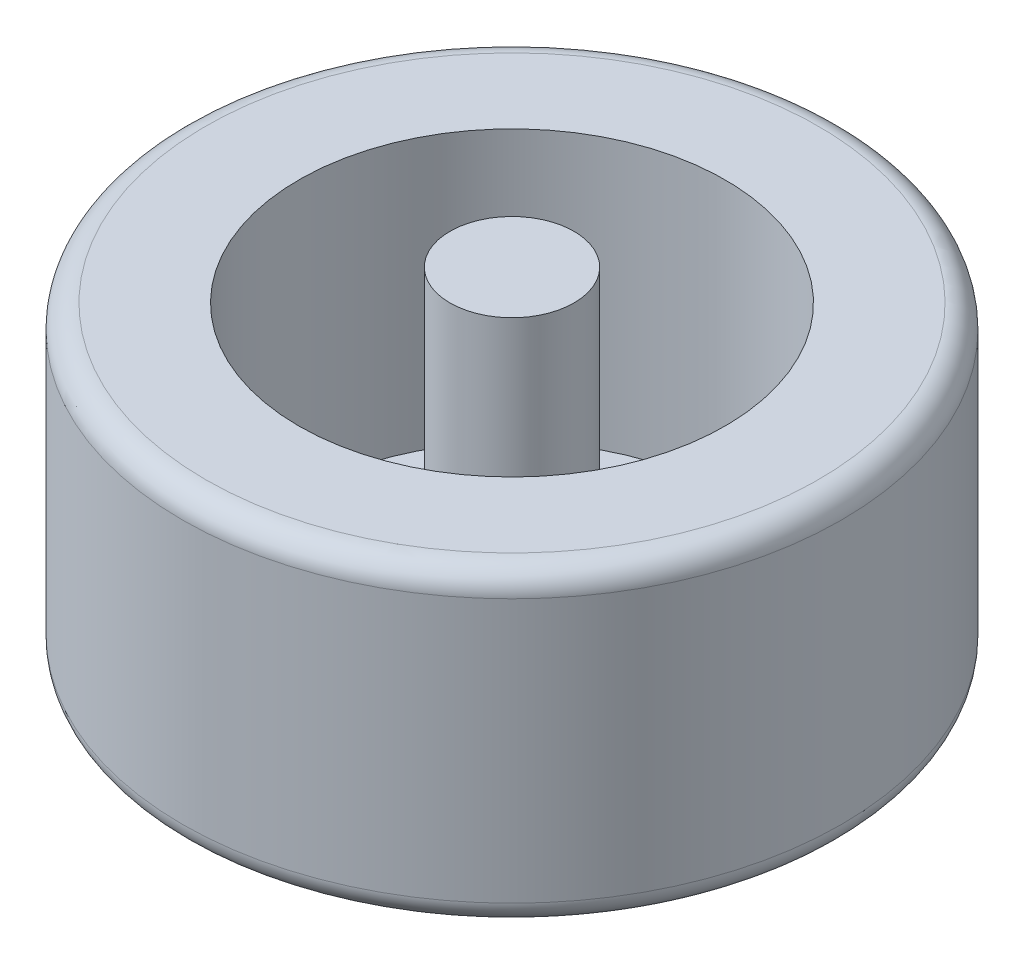
ISO-10303-21;
HEADER;
FILE_DESCRIPTION(('STEP AP214'),'2;1');
FILE_NAME('part.step','',(''),(''),'','','');
FILE_SCHEMA(('AUTOMOTIVE_DESIGN { 1 0 10303 214 1 1 1 1 }'));
ENDSEC;
DATA;
#1=APPLICATION_CONTEXT('core data for automotive mechanical design processes');
#2=APPLICATION_PROTOCOL_DEFINITION('international standard','automotive_design',2000,#1);
#3=PRODUCT_CONTEXT('',#1,'mechanical');
#4=PRODUCT('Part','Part','',(#3));
#5=PRODUCT_RELATED_PRODUCT_CATEGORY('part','',(#4));
#6=PRODUCT_DEFINITION_FORMATION('','',#4);
#7=PRODUCT_DEFINITION_CONTEXT('part definition',#1,'design');
#8=PRODUCT_DEFINITION('design','',#6,#7);
#9=PRODUCT_DEFINITION_SHAPE('','',#8);
#10=(LENGTH_UNIT() NAMED_UNIT(*) SI_UNIT(.MILLI.,.METRE.));
#11=(NAMED_UNIT(*) PLANE_ANGLE_UNIT() SI_UNIT($,.RADIAN.));
#12=(NAMED_UNIT(*) SI_UNIT($,.STERADIAN.) SOLID_ANGLE_UNIT());
#13=UNCERTAINTY_MEASURE_WITH_UNIT(LENGTH_MEASURE(1.E-05),#10,'distance_accuracy_value','');
#14=(GEOMETRIC_REPRESENTATION_CONTEXT(3) GLOBAL_UNCERTAINTY_ASSIGNED_CONTEXT((#13)) GLOBAL_UNIT_ASSIGNED_CONTEXT((#10,
#11,#12)) REPRESENTATION_CONTEXT('',''));
#15=CARTESIAN_POINT('',(0.,0.,0.));
#16=DIRECTION('',(0.,0.,1.));
#17=DIRECTION('',(1.,0.,0.));
#18=AXIS2_PLACEMENT_3D('',#15,#16,#17);
#19=CARTESIAN_POINT('',(0.,-30.,-17.75));
#20=DIRECTION('',(0.,1.,0.));
#21=DIRECTION('',(0.,0.,1.));
#22=AXIS2_PLACEMENT_3D('',#19,#20,#21);
#23=CYLINDRICAL_SURFACE('',#22,4.);
#24=CARTESIAN_POINT('',(0.,5.,-17.75));
#25=DIRECTION('',(0.,1.,0.));
#26=DIRECTION('',(0.,0.,1.));
#27=AXIS2_PLACEMENT_3D('',#24,#25,#26);
#28=CIRCLE('',#27,4.);
#29=CARTESIAN_POINT('',(0.,5.,-13.75));
#30=VERTEX_POINT('',#29);
#31=EDGE_CURVE('E71',#30,#30,#28,.T.);
#32=ORIENTED_EDGE('',*,*,#31,.T.);
#33=EDGE_LOOP('',(#32));
#34=FACE_BOUND('',#33,.T.);
#35=CARTESIAN_POINT('',(0.,2.,-17.75));
#36=DIRECTION('',(0.,-1.,0.));
#37=DIRECTION('',(0.,0.,-1.));
#38=AXIS2_PLACEMENT_3D('',#35,#36,#37);
#39=CIRCLE('',#38,4.);
#40=CARTESIAN_POINT('',(0.,2.,-21.75));
#41=VERTEX_POINT('',#40);
#42=EDGE_CURVE('E93',#41,#41,#39,.F.);
#43=ORIENTED_EDGE('',*,*,#42,.F.);
#44=EDGE_LOOP('',(#43));
#45=FACE_BOUND('',#44,.T.);
#46=ADVANCED_FACE('F37',(#34,#45),#23,.F.);
#47=CARTESIAN_POINT('',(12.5511453660612,-30.,-12.5511453660612));
#48=DIRECTION('',(0.,1.,0.));
#49=DIRECTION('',(0.,0.,1.));
#50=AXIS2_PLACEMENT_3D('',#47,#48,#49);
#51=CYLINDRICAL_SURFACE('',#50,4.);
#52=CARTESIAN_POINT('',(12.5511453660612,5.,-12.5511453660612));
#53=DIRECTION('',(0.,1.,0.));
#54=DIRECTION('',(-0.707106781186549,0.,0.707106781186546));
#55=AXIS2_PLACEMENT_3D('',#52,#53,#54);
#56=CIRCLE('',#55,4.);
#57=CARTESIAN_POINT('',(9.72271824131505,5.,-9.72271824131501));
#58=VERTEX_POINT('',#57);
#59=EDGE_CURVE('E74',#58,#58,#56,.T.);
#60=ORIENTED_EDGE('',*,*,#59,.T.);
#61=EDGE_LOOP('',(#60));
#62=FACE_BOUND('',#61,.T.);
#63=CARTESIAN_POINT('',(12.5511453660612,2.,-12.5511453660612));
#64=DIRECTION('',(0.,-1.,0.));
#65=DIRECTION('',(0.,0.,-1.));
#66=AXIS2_PLACEMENT_3D('',#63,#64,#65);
#67=CIRCLE('',#66,4.);
#68=CARTESIAN_POINT('',(12.5511453660612,2.,-16.5511453660612));
#69=VERTEX_POINT('',#68);
#70=EDGE_CURVE('E98',#69,#69,#67,.F.);
#71=ORIENTED_EDGE('',*,*,#70,.F.);
#72=EDGE_LOOP('',(#71));
#73=FACE_BOUND('',#72,.T.);
#74=ADVANCED_FACE('F144',(#62,#73),#51,.F.);
#75=CARTESIAN_POINT('',(-12.5511453660611,-30.,-12.5511453660614));
#76=DIRECTION('',(0.,1.,0.));
#77=DIRECTION('',(0.,0.,1.));
#78=AXIS2_PLACEMENT_3D('',#75,#76,#77);
#79=CYLINDRICAL_SURFACE('',#78,4.);
#80=CARTESIAN_POINT('',(-12.5511453660611,5.,-12.5511453660614));
#81=DIRECTION('',(0.,1.,0.));
#82=DIRECTION('',(0.707106781186539,0.,0.707106781186556));
#83=AXIS2_PLACEMENT_3D('',#80,#81,#82);
#84=CIRCLE('',#83,4.);
#85=CARTESIAN_POINT('',(-9.72271824131491,5.,-9.72271824131515));
#86=VERTEX_POINT('',#85);
#87=EDGE_CURVE('E90',#86,#86,#84,.T.);
#88=ORIENTED_EDGE('',*,*,#87,.T.);
#89=EDGE_LOOP('',(#88));
#90=FACE_BOUND('',#89,.T.);
#91=CARTESIAN_POINT('',(-12.5511453660611,2.,-12.5511453660614));
#92=DIRECTION('',(0.,-1.,0.));
#93=DIRECTION('',(0.,0.,-1.));
#94=AXIS2_PLACEMENT_3D('',#91,#92,#93);
#95=CIRCLE('',#94,4.);
#96=CARTESIAN_POINT('',(-12.5511453660611,2.,-16.5511453660614));
#97=VERTEX_POINT('',#96);
#98=EDGE_CURVE('E101',#97,#97,#95,.F.);
#99=ORIENTED_EDGE('',*,*,#98,.F.);
#100=EDGE_LOOP('',(#99));
#101=FACE_BOUND('',#100,.T.);
#102=ADVANCED_FACE('F149',(#90,#101),#79,.F.);
#103=CARTESIAN_POINT('',(-17.75,-30.,-1.85921381293397E-13));
#104=DIRECTION('',(0.,1.,0.));
#105=DIRECTION('',(0.,0.,1.));
#106=AXIS2_PLACEMENT_3D('',#103,#104,#105);
#107=CYLINDRICAL_SURFACE('',#106,4.);
#108=CARTESIAN_POINT('',(-17.75,5.,-1.85921381293397E-13));
#109=DIRECTION('',(0.,1.,0.));
#110=DIRECTION('',(1.,0.,0.));
#111=AXIS2_PLACEMENT_3D('',#108,#109,#110);
#112=CIRCLE('',#111,4.);
#113=CARTESIAN_POINT('',(-13.75,5.,-1.44023605227279E-13));
#114=VERTEX_POINT('',#113);
#115=EDGE_CURVE('E82',#114,#114,#112,.T.);
#116=ORIENTED_EDGE('',*,*,#115,.T.);
#117=EDGE_LOOP('',(#116));
#118=FACE_BOUND('',#117,.T.);
#119=CARTESIAN_POINT('',(-17.75,2.,-1.85921381293397E-13));
#120=DIRECTION('',(0.,-1.,0.));
#121=DIRECTION('',(0.,0.,-1.));
#122=AXIS2_PLACEMENT_3D('',#119,#120,#121);
#123=CIRCLE('',#122,4.);
#124=CARTESIAN_POINT('',(-17.75,2.,-4.00000000000019));
#125=VERTEX_POINT('',#124);
#126=EDGE_CURVE('E104',#125,#125,#123,.F.);
#127=ORIENTED_EDGE('',*,*,#126,.F.);
#128=EDGE_LOOP('',(#127));
#129=FACE_BOUND('',#128,.T.);
#130=ADVANCED_FACE('F158',(#118,#129),#107,.F.);
#131=CARTESIAN_POINT('',(-12.5511453660613,-30.,12.5511453660611));
#132=DIRECTION('',(0.,1.,0.));
#133=DIRECTION('',(0.,0.,1.));
#134=AXIS2_PLACEMENT_3D('',#131,#132,#133);
#135=CYLINDRICAL_SURFACE('',#134,4.);
#136=CARTESIAN_POINT('',(-12.5511453660613,5.,12.5511453660611));
#137=DIRECTION('',(0.,1.,0.));
#138=DIRECTION('',(0.707106781186554,0.,-0.707106781186541));
#139=AXIS2_PLACEMENT_3D('',#136,#137,#138);
#140=CIRCLE('',#139,4.);
#141=CARTESIAN_POINT('',(-9.72271824131511,5.,9.72271824131495));
#142=VERTEX_POINT('',#141);
#143=EDGE_CURVE('E78',#142,#142,#140,.T.);
#144=ORIENTED_EDGE('',*,*,#143,.T.);
#145=EDGE_LOOP('',(#144));
#146=FACE_BOUND('',#145,.T.);
#147=CARTESIAN_POINT('',(-12.5511453660613,2.,12.5511453660611));
#148=DIRECTION('',(0.,-1.,0.));
#149=DIRECTION('',(0.,0.,-1.));
#150=AXIS2_PLACEMENT_3D('',#147,#148,#149);
#151=CIRCLE('',#150,4.);
#152=CARTESIAN_POINT('',(-12.5511453660613,2.,8.55114536606111));
#153=VERTEX_POINT('',#152);
#154=EDGE_CURVE('E107',#153,#153,#151,.F.);
#155=ORIENTED_EDGE('',*,*,#154,.F.);
#156=EDGE_LOOP('',(#155));
#157=FACE_BOUND('',#156,.T.);
#158=ADVANCED_FACE('F154',(#146,#157),#135,.F.);
#159=CARTESIAN_POINT('',(0.,-30.,17.75));
#160=DIRECTION('',(0.,1.,0.));
#161=DIRECTION('',(0.,0.,1.));
#162=AXIS2_PLACEMENT_3D('',#159,#160,#161);
#163=CYLINDRICAL_SURFACE('',#162,4.);
#164=CARTESIAN_POINT('',(0.,5.,17.75));
#165=DIRECTION('',(0.,1.,0.));
#166=DIRECTION('',(0.,0.,-1.));
#167=AXIS2_PLACEMENT_3D('',#164,#165,#166);
#168=CIRCLE('',#167,4.);
#169=CARTESIAN_POINT('',(0.,5.,13.75));
#170=VERTEX_POINT('',#169);
#171=EDGE_CURVE('E81',#170,#170,#168,.T.);
#172=ORIENTED_EDGE('',*,*,#171,.T.);
#173=EDGE_LOOP('',(#172));
#174=FACE_BOUND('',#173,.T.);
#175=CARTESIAN_POINT('',(0.,2.,17.75));
#176=DIRECTION('',(0.,-1.,0.));
#177=DIRECTION('',(0.,0.,-1.));
#178=AXIS2_PLACEMENT_3D('',#175,#176,#177);
#179=CIRCLE('',#178,4.);
#180=CARTESIAN_POINT('',(0.,2.,13.75));
#181=VERTEX_POINT('',#180);
#182=EDGE_CURVE('E110',#181,#181,#179,.F.);
#183=ORIENTED_EDGE('',*,*,#182,.F.);
#184=EDGE_LOOP('',(#183));
#185=FACE_BOUND('',#184,.T.);
#186=ADVANCED_FACE('F157',(#174,#185),#163,.F.);
#187=CARTESIAN_POINT('',(12.5511453660612,-30.,12.5511453660613));
#188=DIRECTION('',(0.,1.,0.));
#189=DIRECTION('',(0.,0.,1.));
#190=AXIS2_PLACEMENT_3D('',#187,#188,#189);
#191=CYLINDRICAL_SURFACE('',#190,4.);
#192=CARTESIAN_POINT('',(12.5511453660612,5.,12.5511453660613));
#193=DIRECTION('',(0.,1.,0.));
#194=DIRECTION('',(-0.707106781186544,0.,-0.707106781186551));
#195=AXIS2_PLACEMENT_3D('',#192,#193,#194);
#196=CIRCLE('',#195,4.);
#197=CARTESIAN_POINT('',(9.72271824131498,5.,9.72271824131508));
#198=VERTEX_POINT('',#197);
#199=EDGE_CURVE('E85',#198,#198,#196,.T.);
#200=ORIENTED_EDGE('',*,*,#199,.T.);
#201=EDGE_LOOP('',(#200));
#202=FACE_BOUND('',#201,.T.);
#203=CARTESIAN_POINT('',(12.5511453660612,2.,12.5511453660613));
#204=DIRECTION('',(0.,-1.,0.));
#205=DIRECTION('',(0.,0.,-1.));
#206=AXIS2_PLACEMENT_3D('',#203,#204,#205);
#207=CIRCLE('',#206,4.);
#208=CARTESIAN_POINT('',(12.5511453660612,2.,8.55114536606128));
#209=VERTEX_POINT('',#208);
#210=EDGE_CURVE('E61',#209,#209,#207,.F.);
#211=ORIENTED_EDGE('',*,*,#210,.F.);
#212=EDGE_LOOP('',(#211));
#213=FACE_BOUND('',#212,.T.);
#214=ADVANCED_FACE('F162',(#202,#213),#191,.F.);
#215=CARTESIAN_POINT('',(17.75,-30.,0.));
#216=DIRECTION('',(0.,1.,0.));
#217=DIRECTION('',(0.,0.,1.));
#218=AXIS2_PLACEMENT_3D('',#215,#216,#217);
#219=CYLINDRICAL_SURFACE('',#218,4.);
#220=CARTESIAN_POINT('',(17.75,5.,0.));
#221=DIRECTION('',(0.,1.,0.));
#222=DIRECTION('',(-1.,0.,0.));
#223=AXIS2_PLACEMENT_3D('',#220,#221,#222);
#224=CIRCLE('',#223,4.);
#225=CARTESIAN_POINT('',(13.75,5.,0.));
#226=VERTEX_POINT('',#225);
#227=EDGE_CURVE('E77',#226,#226,#224,.T.);
#228=ORIENTED_EDGE('',*,*,#227,.T.);
#229=EDGE_LOOP('',(#228));
#230=FACE_BOUND('',#229,.T.);
#231=CARTESIAN_POINT('',(17.75,2.,0.));
#232=DIRECTION('',(0.,-1.,0.));
#233=DIRECTION('',(0.,0.,-1.));
#234=AXIS2_PLACEMENT_3D('',#231,#232,#233);
#235=CIRCLE('',#234,4.);
#236=CARTESIAN_POINT('',(17.75,2.,-3.99999999999994));
#237=VERTEX_POINT('',#236);
#238=EDGE_CURVE('E58',#237,#237,#235,.F.);
#239=ORIENTED_EDGE('',*,*,#238,.F.);
#240=EDGE_LOOP('',(#239));
#241=FACE_BOUND('',#240,.T.);
#242=ADVANCED_FACE('F166',(#230,#241),#219,.F.);
#243=CARTESIAN_POINT('',(0.,40.,0.));
#244=DIRECTION('',(0.,-1.,0.));
#245=DIRECTION('',(0.,0.,-1.));
#246=AXIS2_PLACEMENT_3D('',#243,#244,#245);
#247=CYLINDRICAL_SURFACE('',#246,42.5);
#248=CARTESIAN_POINT('',(0.,3.,0.));
#249=DIRECTION('',(0.,1.,0.));
#250=DIRECTION('',(0.,0.,1.));
#251=AXIS2_PLACEMENT_3D('',#248,#249,#250);
#252=CIRCLE('',#251,42.5);
#253=CARTESIAN_POINT('',(0.,3.,42.5));
#254=VERTEX_POINT('',#253);
#255=EDGE_CURVE('E48',#254,#254,#252,.T.);
#256=ORIENTED_EDGE('',*,*,#255,.T.);
#257=EDGE_LOOP('',(#256));
#258=FACE_BOUND('',#257,.T.);
#259=CARTESIAN_POINT('',(0.,37.,0.));
#260=DIRECTION('',(0.,1.,0.));
#261=DIRECTION('',(0.,0.,1.));
#262=AXIS2_PLACEMENT_3D('',#259,#260,#261);
#263=CIRCLE('',#262,42.5);
#264=CARTESIAN_POINT('',(0.,37.,42.5));
#265=VERTEX_POINT('',#264);
#266=EDGE_CURVE('E52',#265,#265,#263,.F.);
#267=ORIENTED_EDGE('',*,*,#266,.T.);
#268=EDGE_LOOP('',(#267));
#269=FACE_BOUND('',#268,.T.);
#270=ADVANCED_FACE('F170',(#258,#269),#247,.T.);
#271=CARTESIAN_POINT('',(0.,40.,0.));
#272=DIRECTION('',(0.,1.,0.));
#273=DIRECTION('',(0.,0.,1.));
#274=AXIS2_PLACEMENT_3D('',#271,#272,#273);
#275=PLANE('',#274);
#276=CARTESIAN_POINT('',(0.,40.,0.));
#277=DIRECTION('',(0.,1.,0.));
#278=DIRECTION('',(0.,0.,1.));
#279=AXIS2_PLACEMENT_3D('',#276,#277,#278);
#280=CIRCLE('',#279,39.5);
#281=CARTESIAN_POINT('',(0.,40.,39.5));
#282=VERTEX_POINT('',#281);
#283=EDGE_CURVE('E10',#282,#282,#280,.T.);
#284=ORIENTED_EDGE('',*,*,#283,.T.);
#285=EDGE_LOOP('',(#284));
#286=FACE_BOUND('',#285,.T.);
#287=CARTESIAN_POINT('',(0.,40.,0.));
#288=DIRECTION('',(0.,1.,0.));
#289=DIRECTION('',(0.,0.,1.));
#290=AXIS2_PLACEMENT_3D('',#287,#288,#289);
#291=CIRCLE('',#290,27.5);
#292=CARTESIAN_POINT('',(0.,40.,27.5));
#293=VERTEX_POINT('',#292);
#294=EDGE_CURVE('E63',#293,#293,#291,.T.);
#295=ORIENTED_EDGE('',*,*,#294,.F.);
#296=EDGE_LOOP('',(#295));
#297=FACE_BOUND('',#296,.T.);
#298=ADVANCED_FACE('F195',(#286,#297),#275,.T.);
#299=CARTESIAN_POINT('',(0.,0.,0.));
#300=DIRECTION('',(0.,1.,0.));
#301=DIRECTION('',(0.,0.,1.));
#302=AXIS2_PLACEMENT_3D('',#299,#300,#301);
#303=PLANE('',#302);
#304=CARTESIAN_POINT('',(0.,0.,0.));
#305=DIRECTION('',(0.,1.,0.));
#306=DIRECTION('',(0.,0.,1.));
#307=AXIS2_PLACEMENT_3D('',#304,#305,#306);
#308=CIRCLE('',#307,39.5);
#309=CARTESIAN_POINT('',(0.,0.,39.5));
#310=VERTEX_POINT('',#309);
#311=EDGE_CURVE('E44',#310,#310,#308,.F.);
#312=ORIENTED_EDGE('',*,*,#311,.T.);
#313=EDGE_LOOP('',(#312));
#314=FACE_BOUND('',#313,.T.);
#315=CARTESIAN_POINT('',(0.,0.,0.));
#316=DIRECTION('',(0.,-1.,0.));
#317=DIRECTION('',(0.,0.,-1.));
#318=AXIS2_PLACEMENT_3D('',#315,#316,#317);
#319=CIRCLE('',#318,27.5);
#320=CARTESIAN_POINT('',(0.,0.,-27.5));
#321=VERTEX_POINT('',#320);
#322=EDGE_CURVE('E115',#321,#321,#319,.T.);
#323=ORIENTED_EDGE('',*,*,#322,.F.);
#324=EDGE_LOOP('',(#323));
#325=FACE_BOUND('',#324,.T.);
#326=ADVANCED_FACE('F197',(#314,#325),#303,.F.);
#327=CARTESIAN_POINT('',(0.,5.,0.));
#328=DIRECTION('',(0.,1.,0.));
#329=DIRECTION('',(0.,0.,1.));
#330=AXIS2_PLACEMENT_3D('',#327,#328,#329);
#331=CYLINDRICAL_SURFACE('',#330,27.5);
#332=CARTESIAN_POINT('',(0.,5.,0.));
#333=DIRECTION('',(0.,1.,0.));
#334=DIRECTION('',(0.,0.,1.));
#335=AXIS2_PLACEMENT_3D('',#332,#333,#334);
#336=CIRCLE('',#335,27.5);
#337=CARTESIAN_POINT('',(0.,5.,27.5));
#338=VERTEX_POINT('',#337);
#339=EDGE_CURVE('E57',#338,#338,#336,.T.);
#340=ORIENTED_EDGE('',*,*,#339,.F.);
#341=EDGE_LOOP('',(#340));
#342=FACE_BOUND('',#341,.T.);
#343=ORIENTED_EDGE('',*,*,#294,.T.);
#344=EDGE_LOOP('',(#343));
#345=FACE_BOUND('',#344,.T.);
#346=ADVANCED_FACE('F139',(#342,#345),#331,.F.);
#347=CARTESIAN_POINT('',(0.,5.,0.));
#348=DIRECTION('',(0.,1.,0.));
#349=DIRECTION('',(0.,0.,1.));
#350=AXIS2_PLACEMENT_3D('',#347,#348,#349);
#351=PLANE('',#350);
#352=ORIENTED_EDGE('',*,*,#227,.F.);
#353=EDGE_LOOP('',(#352));
#354=FACE_BOUND('',#353,.T.);
#355=ORIENTED_EDGE('',*,*,#199,.F.);
#356=EDGE_LOOP('',(#355));
#357=FACE_BOUND('',#356,.T.);
#358=ORIENTED_EDGE('',*,*,#171,.F.);
#359=EDGE_LOOP('',(#358));
#360=FACE_BOUND('',#359,.T.);
#361=ORIENTED_EDGE('',*,*,#143,.F.);
#362=EDGE_LOOP('',(#361));
#363=FACE_BOUND('',#362,.T.);
#364=ORIENTED_EDGE('',*,*,#115,.F.);
#365=EDGE_LOOP('',(#364));
#366=FACE_BOUND('',#365,.T.);
#367=ORIENTED_EDGE('',*,*,#87,.F.);
#368=EDGE_LOOP('',(#367));
#369=FACE_BOUND('',#368,.T.);
#370=ORIENTED_EDGE('',*,*,#59,.F.);
#371=EDGE_LOOP('',(#370));
#372=FACE_BOUND('',#371,.T.);
#373=ORIENTED_EDGE('',*,*,#31,.F.);
#374=EDGE_LOOP('',(#373));
#375=FACE_BOUND('',#374,.T.);
#376=CARTESIAN_POINT('',(0.,5.,0.));
#377=DIRECTION('',(0.,1.,0.));
#378=DIRECTION('',(0.,0.,1.));
#379=AXIS2_PLACEMENT_3D('',#376,#377,#378);
#380=CIRCLE('',#379,8.);
#381=CARTESIAN_POINT('',(0.,5.,8.));
#382=VERTEX_POINT('',#381);
#383=EDGE_CURVE('E66',#382,#382,#380,.T.);
#384=ORIENTED_EDGE('',*,*,#383,.F.);
#385=EDGE_LOOP('',(#384));
#386=FACE_BOUND('',#385,.T.);
#387=ORIENTED_EDGE('',*,*,#339,.T.);
#388=EDGE_LOOP('',(#387));
#389=FACE_BOUND('',#388,.T.);
#390=ADVANCED_FACE('F129',(#354,#357,#360,#363,#366,#369,#372,#375,#386,#389),#351,.T.);
#391=CARTESIAN_POINT('',(0.,5.,0.));
#392=DIRECTION('',(0.,1.,0.));
#393=DIRECTION('',(0.,0.,1.));
#394=AXIS2_PLACEMENT_3D('',#391,#392,#393);
#395=CYLINDRICAL_SURFACE('',#394,8.);
#396=ORIENTED_EDGE('',*,*,#383,.T.);
#397=EDGE_LOOP('',(#396));
#398=FACE_BOUND('',#397,.T.);
#399=CARTESIAN_POINT('',(0.,44.,0.));
#400=DIRECTION('',(0.,1.,0.));
#401=DIRECTION('',(0.,0.,1.));
#402=AXIS2_PLACEMENT_3D('',#399,#400,#401);
#403=CIRCLE('',#402,8.);
#404=CARTESIAN_POINT('',(0.,44.,8.));
#405=VERTEX_POINT('',#404);
#406=EDGE_CURVE('E118',#405,#405,#403,.T.);
#407=ORIENTED_EDGE('',*,*,#406,.F.);
#408=EDGE_LOOP('',(#407));
#409=FACE_BOUND('',#408,.T.);
#410=ADVANCED_FACE('F126',(#398,#409),#395,.T.);
#411=CARTESIAN_POINT('',(0.,2.,0.));
#412=DIRECTION('',(0.,-1.,0.));
#413=DIRECTION('',(0.,0.,-1.));
#414=AXIS2_PLACEMENT_3D('',#411,#412,#413);
#415=PLANE('',#414);
#416=CARTESIAN_POINT('',(0.,2.,0.));
#417=DIRECTION('',(0.,-1.,0.));
#418=DIRECTION('',(0.,0.,-1.));
#419=AXIS2_PLACEMENT_3D('',#416,#417,#418);
#420=CIRCLE('',#419,27.5);
#421=CARTESIAN_POINT('',(0.,2.,-27.5));
#422=VERTEX_POINT('',#421);
#423=EDGE_CURVE('E62',#422,#422,#420,.T.);
#424=ORIENTED_EDGE('',*,*,#423,.T.);
#425=EDGE_LOOP('',(#424));
#426=FACE_BOUND('',#425,.T.);
#427=ORIENTED_EDGE('',*,*,#238,.T.);
#428=EDGE_LOOP('',(#427));
#429=FACE_BOUND('',#428,.T.);
#430=ORIENTED_EDGE('',*,*,#210,.T.);
#431=EDGE_LOOP('',(#430));
#432=FACE_BOUND('',#431,.T.);
#433=ORIENTED_EDGE('',*,*,#182,.T.);
#434=EDGE_LOOP('',(#433));
#435=FACE_BOUND('',#434,.T.);
#436=ORIENTED_EDGE('',*,*,#154,.T.);
#437=EDGE_LOOP('',(#436));
#438=FACE_BOUND('',#437,.T.);
#439=ORIENTED_EDGE('',*,*,#126,.T.);
#440=EDGE_LOOP('',(#439));
#441=FACE_BOUND('',#440,.T.);
#442=ORIENTED_EDGE('',*,*,#98,.T.);
#443=EDGE_LOOP('',(#442));
#444=FACE_BOUND('',#443,.T.);
#445=ORIENTED_EDGE('',*,*,#70,.T.);
#446=EDGE_LOOP('',(#445));
#447=FACE_BOUND('',#446,.T.);
#448=ORIENTED_EDGE('',*,*,#42,.T.);
#449=EDGE_LOOP('',(#448));
#450=FACE_BOUND('',#449,.T.);
#451=ADVANCED_FACE('F128',(#426,#429,#432,#435,#438,#441,#444,#447,#450),#415,.T.);
#452=CARTESIAN_POINT('',(0.,2.,0.));
#453=DIRECTION('',(0.,-1.,0.));
#454=DIRECTION('',(0.,0.,-1.));
#455=AXIS2_PLACEMENT_3D('',#452,#453,#454);
#456=CYLINDRICAL_SURFACE('',#455,27.5);
#457=ORIENTED_EDGE('',*,*,#423,.F.);
#458=EDGE_LOOP('',(#457));
#459=FACE_BOUND('',#458,.T.);
#460=ORIENTED_EDGE('',*,*,#322,.T.);
#461=EDGE_LOOP('',(#460));
#462=FACE_BOUND('',#461,.T.);
#463=ADVANCED_FACE('F136',(#459,#462),#456,.F.);
#464=CARTESIAN_POINT('',(0.,44.,0.));
#465=DIRECTION('',(0.,1.,0.));
#466=DIRECTION('',(0.,0.,1.));
#467=AXIS2_PLACEMENT_3D('',#464,#465,#466);
#468=PLANE('',#467);
#469=ORIENTED_EDGE('',*,*,#406,.T.);
#470=EDGE_LOOP('',(#469));
#471=FACE_BOUND('',#470,.T.);
#472=ADVANCED_FACE('F124',(#471),#468,.T.);
#473=CARTESIAN_POINT('',(0.,3.,0.));
#474=DIRECTION('',(0.,1.,0.));
#475=DIRECTION('',(0.,0.,1.));
#476=AXIS2_PLACEMENT_3D('',#473,#474,#475);
#477=TOROIDAL_SURFACE('',#476,39.5,3.);
#478=ORIENTED_EDGE('',*,*,#311,.F.);
#479=EDGE_LOOP('',(#478));
#480=FACE_BOUND('',#479,.T.);
#481=ORIENTED_EDGE('',*,*,#255,.F.);
#482=EDGE_LOOP('',(#481));
#483=FACE_BOUND('',#482,.T.);
#484=ADVANCED_FACE('F182',(#480,#483),#477,.T.);
#485=CARTESIAN_POINT('',(0.,37.,0.));
#486=DIRECTION('',(0.,1.,0.));
#487=DIRECTION('',(0.,0.,1.));
#488=AXIS2_PLACEMENT_3D('',#485,#486,#487);
#489=TOROIDAL_SURFACE('',#488,39.5,3.);
#490=ORIENTED_EDGE('',*,*,#266,.F.);
#491=EDGE_LOOP('',(#490));
#492=FACE_BOUND('',#491,.T.);
#493=ORIENTED_EDGE('',*,*,#283,.F.);
#494=EDGE_LOOP('',(#493));
#495=FACE_BOUND('',#494,.T.);
#496=ADVANCED_FACE('F39',(#492,#495),#489,.T.);
#497=CLOSED_SHELL('',(#46,#74,#102,#130,#158,#186,#214,#242,#270,#298,#326,#346,#390,#410,#451,
#463,#472,#484,#496));
#498=MANIFOLD_SOLID_BREP('B2',#497);
#499=ADVANCED_BREP_SHAPE_REPRESENTATION('',(#18,#498),#14);
#500=SHAPE_DEFINITION_REPRESENTATION(#9,#499);
ENDSEC;
END-ISO-10303-21;
